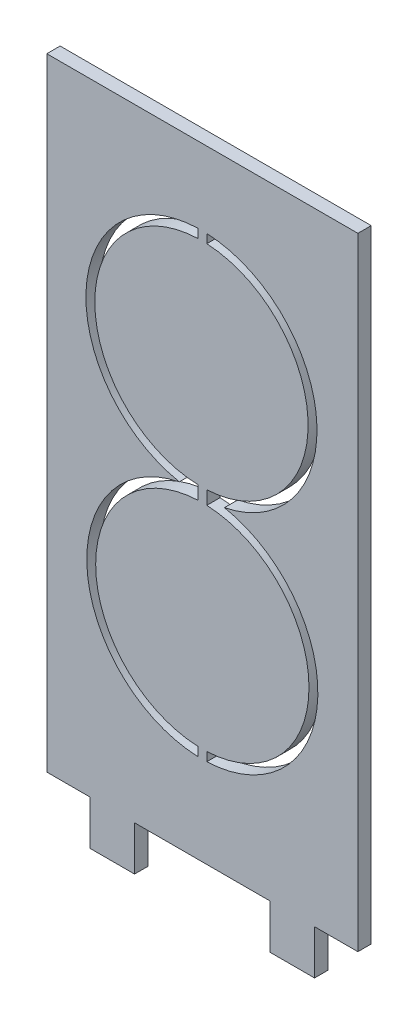
ISO-10303-21;
HEADER;
FILE_DESCRIPTION(('STEP AP214'),'2;1');
FILE_NAME('part.step','',(''),(''),'','','');
FILE_SCHEMA(('AUTOMOTIVE_DESIGN { 1 0 10303 214 1 1 1 1 }'));
ENDSEC;
DATA;
#1=APPLICATION_CONTEXT('core data for automotive mechanical design processes');
#2=APPLICATION_PROTOCOL_DEFINITION('international standard','automotive_design',2000,#1);
#3=PRODUCT_CONTEXT('',#1,'mechanical');
#4=PRODUCT('Part','Part','',(#3));
#5=PRODUCT_RELATED_PRODUCT_CATEGORY('part','',(#4));
#6=PRODUCT_DEFINITION_FORMATION('','',#4);
#7=PRODUCT_DEFINITION_CONTEXT('part definition',#1,'design');
#8=PRODUCT_DEFINITION('design','',#6,#7);
#9=PRODUCT_DEFINITION_SHAPE('','',#8);
#10=(LENGTH_UNIT() NAMED_UNIT(*) SI_UNIT(.MILLI.,.METRE.));
#11=(NAMED_UNIT(*) PLANE_ANGLE_UNIT() SI_UNIT($,.RADIAN.));
#12=(NAMED_UNIT(*) SI_UNIT($,.STERADIAN.) SOLID_ANGLE_UNIT());
#13=UNCERTAINTY_MEASURE_WITH_UNIT(LENGTH_MEASURE(1.E-05),#10,'distance_accuracy_value','');
#14=(GEOMETRIC_REPRESENTATION_CONTEXT(3) GLOBAL_UNCERTAINTY_ASSIGNED_CONTEXT((#13)) GLOBAL_UNIT_ASSIGNED_CONTEXT((#10,
#11,#12)) REPRESENTATION_CONTEXT('',''));
#15=CARTESIAN_POINT('',(0.,0.,0.));
#16=DIRECTION('',(0.,0.,1.));
#17=DIRECTION('',(1.,0.,0.));
#18=AXIS2_PLACEMENT_3D('',#15,#16,#17);
#19=CARTESIAN_POINT('',(17.,68.1857282912457,0.));
#20=DIRECTION('',(-1.,0.,0.));
#21=DIRECTION('',(0.,-1.,0.));
#22=AXIS2_PLACEMENT_3D('',#19,#20,#21);
#23=PLANE('',#22);
#24=DIRECTION('',(0.,0.,1.));
#25=VECTOR('',#24,1.);
#26=CARTESIAN_POINT('',(17.,16.0104211917182,0.));
#27=LINE('',#26,#25);
#28=CARTESIAN_POINT('',(17.,16.0104211917182,0.));
#29=VERTEX_POINT('',#28);
#30=CARTESIAN_POINT('',(17.,16.0104211917182,1.5));
#31=VERTEX_POINT('',#30);
#32=EDGE_CURVE('E221',#29,#31,#27,.T.);
#33=ORIENTED_EDGE('',*,*,#32,.F.);
#34=DIRECTION('',(0.,-1.,0.));
#35=VECTOR('',#34,1.);
#36=CARTESIAN_POINT('',(17.,68.1857282912457,0.));
#37=LINE('',#36,#35);
#38=CARTESIAN_POINT('',(17.,15.0096189432334,0.));
#39=VERTEX_POINT('',#38);
#40=EDGE_CURVE('E254',#29,#39,#37,.T.);
#41=ORIENTED_EDGE('',*,*,#40,.T.);
#42=DIRECTION('',(0.,0.,1.));
#43=VECTOR('',#42,1.);
#44=CARTESIAN_POINT('',(17.,15.0096189432334,0.));
#45=LINE('',#44,#43);
#46=CARTESIAN_POINT('',(17.,15.0096189432334,1.5));
#47=VERTEX_POINT('',#46);
#48=EDGE_CURVE('E426',#47,#39,#45,.F.);
#49=ORIENTED_EDGE('',*,*,#48,.F.);
#50=DIRECTION('',(0.,-1.,0.));
#51=VECTOR('',#50,1.);
#52=CARTESIAN_POINT('',(17.,68.1857282912457,1.5));
#53=LINE('',#52,#51);
#54=EDGE_CURVE('E241',#31,#47,#53,.T.);
#55=ORIENTED_EDGE('',*,*,#54,.F.);
#56=EDGE_LOOP('',(#33,#41,#49,#55));
#57=FACE_BOUND('',#56,.T.);
#58=ADVANCED_FACE('F39',(#57),#23,.T.);
#59=CARTESIAN_POINT('',(18.,68.1857282912457,0.));
#60=DIRECTION('',(1.,0.,0.));
#61=DIRECTION('',(0.,1.,0.));
#62=AXIS2_PLACEMENT_3D('',#59,#60,#61);
#63=PLANE('',#62);
#64=DIRECTION('',(0.,0.,1.));
#65=VECTOR('',#64,1.);
#66=CARTESIAN_POINT('',(18.,39.9895788082818,0.));
#67=LINE('',#66,#65);
#68=CARTESIAN_POINT('',(18.,39.9895788082818,0.));
#69=VERTEX_POINT('',#68);
#70=CARTESIAN_POINT('',(18.,39.9895788082818,1.5));
#71=VERTEX_POINT('',#70);
#72=EDGE_CURVE('E11',#69,#71,#67,.T.);
#73=ORIENTED_EDGE('',*,*,#72,.F.);
#74=DIRECTION('',(0.,1.,0.));
#75=VECTOR('',#74,1.);
#76=CARTESIAN_POINT('',(18.,68.1857282912457,0.));
#77=LINE('',#76,#75);
#78=CARTESIAN_POINT('',(18.,41.5150093867371,0.));
#79=VERTEX_POINT('',#78);
#80=EDGE_CURVE('E453',#69,#79,#77,.T.);
#81=ORIENTED_EDGE('',*,*,#80,.T.);
#82=DIRECTION('',(0.,0.,1.));
#83=VECTOR('',#82,1.);
#84=CARTESIAN_POINT('',(18.,41.5150093867371,0.));
#85=LINE('',#84,#83);
#86=CARTESIAN_POINT('',(18.,41.5150093867371,1.5));
#87=VERTEX_POINT('',#86);
#88=EDGE_CURVE('E430',#87,#79,#85,.F.);
#89=ORIENTED_EDGE('',*,*,#88,.F.);
#90=DIRECTION('',(0.,1.,0.));
#91=VECTOR('',#90,1.);
#92=CARTESIAN_POINT('',(18.,68.1857282912457,1.5));
#93=LINE('',#92,#91);
#94=EDGE_CURVE('E255',#71,#87,#93,.T.);
#95=ORIENTED_EDGE('',*,*,#94,.F.);
#96=EDGE_LOOP('',(#73,#81,#89,#95));
#97=FACE_BOUND('',#96,.T.);
#98=ADVANCED_FACE('F526',(#97),#63,.T.);
#99=DIRECTION('',(0.,0.,1.));
#100=VECTOR('',#99,1.);
#101=CARTESIAN_POINT('',(17.,39.9895788082818,0.));
#102=LINE('',#101,#100);
#103=CARTESIAN_POINT('',(17.,39.9895788082818,1.5));
#104=VERTEX_POINT('',#103);
#105=CARTESIAN_POINT('',(17.,39.9895788082818,0.));
#106=VERTEX_POINT('',#105);
#107=EDGE_CURVE('E218',#104,#106,#102,.F.);
#108=ORIENTED_EDGE('',*,*,#107,.F.);
#109=CARTESIAN_POINT('',(17.,41.506668519548,1.5));
#110=VERTEX_POINT('',#109);
#111=EDGE_CURVE('E230',#110,#104,#53,.T.);
#112=ORIENTED_EDGE('',*,*,#111,.F.);
#113=DIRECTION('',(0.,0.,1.));
#114=VECTOR('',#113,1.);
#115=CARTESIAN_POINT('',(17.,41.506668519548,0.));
#116=LINE('',#115,#114);
#117=CARTESIAN_POINT('',(17.,41.506668519548,0.));
#118=VERTEX_POINT('',#117);
#119=EDGE_CURVE('E246',#118,#110,#116,.T.);
#120=ORIENTED_EDGE('',*,*,#119,.F.);
#121=EDGE_CURVE('E232',#118,#106,#37,.T.);
#122=ORIENTED_EDGE('',*,*,#121,.T.);
#123=EDGE_LOOP('',(#108,#112,#120,#122));
#124=FACE_BOUND('',#123,.T.);
#125=ADVANCED_FACE('F228',(#124),#23,.T.);
#126=DIRECTION('',(0.,0.,1.));
#127=VECTOR('',#126,1.);
#128=CARTESIAN_POINT('',(18.,65.4849906132629,0.));
#129=LINE('',#128,#127);
#130=CARTESIAN_POINT('',(18.,65.4849906132629,0.));
#131=VERTEX_POINT('',#130);
#132=CARTESIAN_POINT('',(18.,65.4849906132629,1.5));
#133=VERTEX_POINT('',#132);
#134=EDGE_CURVE('E434',#131,#133,#129,.T.);
#135=ORIENTED_EDGE('',*,*,#134,.F.);
#136=CARTESIAN_POINT('',(18.,66.4861464645983,0.));
#137=VERTEX_POINT('',#136);
#138=EDGE_CURVE('E460',#131,#137,#77,.T.);
#139=ORIENTED_EDGE('',*,*,#138,.T.);
#140=DIRECTION('',(0.,0.,1.));
#141=VECTOR('',#140,1.);
#142=CARTESIAN_POINT('',(18.,66.4861464645983,0.));
#143=LINE('',#142,#141);
#144=CARTESIAN_POINT('',(18.,66.4861464645983,1.5));
#145=VERTEX_POINT('',#144);
#146=EDGE_CURVE('E256',#145,#137,#143,.F.);
#147=ORIENTED_EDGE('',*,*,#146,.F.);
#148=EDGE_CURVE('E245',#133,#145,#93,.T.);
#149=ORIENTED_EDGE('',*,*,#148,.F.);
#150=EDGE_LOOP('',(#135,#139,#147,#149));
#151=FACE_BOUND('',#150,.T.);
#152=ADVANCED_FACE('F532',(#151),#63,.T.);
#153=CARTESIAN_POINT('',(17.4,53.5,0.));
#154=DIRECTION('',(0.,0.,1.));
#155=DIRECTION('',(1.,0.,0.));
#156=AXIS2_PLACEMENT_3D('',#153,#154,#155);
#157=CYLINDRICAL_SURFACE('',#156,13.);
#158=CARTESIAN_POINT('',(17.4,53.5,0.));
#159=DIRECTION('',(0.,0.,1.));
#160=DIRECTION('',(1.,0.,0.));
#161=AXIS2_PLACEMENT_3D('',#158,#159,#160);
#162=CIRCLE('',#161,13.);
#163=CARTESIAN_POINT('',(17.,66.4938446966246,0.));
#164=VERTEX_POINT('',#163);
#165=CARTESIAN_POINT('',(14.9057685249611,40.7415201003832,0.));
#166=VERTEX_POINT('',#165);
#167=EDGE_CURVE('E342',#164,#166,#162,.T.);
#168=ORIENTED_EDGE('',*,*,#167,.F.);
#169=DIRECTION('',(0.,0.,1.));
#170=VECTOR('',#169,1.);
#171=CARTESIAN_POINT('',(17.,66.4938446966246,0.));
#172=LINE('',#171,#170);
#173=CARTESIAN_POINT('',(17.,66.4938446966246,1.5));
#174=VERTEX_POINT('',#173);
#175=EDGE_CURVE('E260',#164,#174,#172,.T.);
#176=ORIENTED_EDGE('',*,*,#175,.T.);
#177=CARTESIAN_POINT('',(17.4,53.5,1.5));
#178=DIRECTION('',(0.,0.,1.));
#179=DIRECTION('',(1.,0.,0.));
#180=AXIS2_PLACEMENT_3D('',#177,#178,#179);
#181=CIRCLE('',#180,13.);
#182=CARTESIAN_POINT('',(14.9057685249611,40.7415201003832,1.5));
#183=VERTEX_POINT('',#182);
#184=EDGE_CURVE('E370',#174,#183,#181,.T.);
#185=ORIENTED_EDGE('',*,*,#184,.T.);
#186=DIRECTION('',(0.,0.,1.));
#187=VECTOR('',#186,1.);
#188=CARTESIAN_POINT('',(14.9057685249611,40.7415201003832,0.));
#189=LINE('',#188,#187);
#190=EDGE_CURVE('E386',#166,#183,#189,.T.);
#191=ORIENTED_EDGE('',*,*,#190,.F.);
#192=EDGE_LOOP('',(#168,#176,#185,#191));
#193=FACE_BOUND('',#192,.T.);
#194=ADVANCED_FACE('F493',(#193),#157,.F.);
#195=CARTESIAN_POINT('',(17.5,28.,0.));
#196=DIRECTION('',(0.,0.,1.));
#197=DIRECTION('',(1.,0.,0.));
#198=AXIS2_PLACEMENT_3D('',#195,#196,#197);
#199=CYLINDRICAL_SURFACE('',#198,13.);
#200=CARTESIAN_POINT('',(17.5,28.,1.5));
#201=DIRECTION('',(0.,0.,1.));
#202=DIRECTION('',(-1.,0.,0.));
#203=AXIS2_PLACEMENT_3D('',#200,#201,#202);
#204=CIRCLE('',#203,13.);
#205=CARTESIAN_POINT('',(14.9132835528399,40.7400509426765,1.5));
#206=VERTEX_POINT('',#205);
#207=EDGE_CURVE('E395',#206,#47,#204,.T.);
#208=ORIENTED_EDGE('',*,*,#207,.T.);
#209=ORIENTED_EDGE('',*,*,#48,.T.);
#210=CARTESIAN_POINT('',(17.5,28.,0.));
#211=DIRECTION('',(0.,0.,1.));
#212=DIRECTION('',(-1.,0.,0.));
#213=AXIS2_PLACEMENT_3D('',#210,#211,#212);
#214=CIRCLE('',#213,13.);
#215=CARTESIAN_POINT('',(14.9132835528399,40.7400509426765,0.));
#216=VERTEX_POINT('',#215);
#217=EDGE_CURVE('E290',#216,#39,#214,.T.);
#218=ORIENTED_EDGE('',*,*,#217,.F.);
#219=DIRECTION('',(0.,0.,1.));
#220=VECTOR('',#219,1.);
#221=CARTESIAN_POINT('',(14.9132835528399,40.7400509426765,0.));
#222=LINE('',#221,#220);
#223=EDGE_CURVE('E392',#216,#206,#222,.T.);
#224=ORIENTED_EDGE('',*,*,#223,.T.);
#225=EDGE_LOOP('',(#208,#209,#218,#224));
#226=FACE_BOUND('',#225,.T.);
#227=ADVANCED_FACE('F481',(#226),#199,.F.);
#228=CARTESIAN_POINT('',(0.,0.,1.5));
#229=DIRECTION('',(0.,1.,0.));
#230=DIRECTION('',(0.,0.,1.));
#231=AXIS2_PLACEMENT_3D('',#228,#229,#230);
#232=PLANE('',#231);
#233=DIRECTION('',(1.,0.,0.));
#234=VECTOR('',#233,1.);
#235=CARTESIAN_POINT('',(0.,0.,1.5));
#236=LINE('',#235,#234);
#237=CARTESIAN_POINT('',(4.875,0.,1.5));
#238=VERTEX_POINT('',#237);
#239=CARTESIAN_POINT('',(9.875,0.,1.5));
#240=VERTEX_POINT('',#239);
#241=EDGE_CURVE('E306',#238,#240,#236,.T.);
#242=ORIENTED_EDGE('',*,*,#241,.F.);
#243=DIRECTION('',(0.,0.,1.));
#244=VECTOR('',#243,1.);
#245=CARTESIAN_POINT('',(4.875,0.,-18.5));
#246=LINE('',#245,#244);
#247=CARTESIAN_POINT('',(4.875,0.,0.));
#248=VERTEX_POINT('',#247);
#249=EDGE_CURVE('E268',#248,#238,#246,.T.);
#250=ORIENTED_EDGE('',*,*,#249,.F.);
#251=DIRECTION('',(1.,0.,0.));
#252=VECTOR('',#251,1.);
#253=CARTESIAN_POINT('',(0.,0.,0.));
#254=LINE('',#253,#252);
#255=CARTESIAN_POINT('',(9.875,0.,0.));
#256=VERTEX_POINT('',#255);
#257=EDGE_CURVE('E264',#248,#256,#254,.T.);
#258=ORIENTED_EDGE('',*,*,#257,.T.);
#259=DIRECTION('',(0.,0.,1.));
#260=VECTOR('',#259,1.);
#261=CARTESIAN_POINT('',(9.875,0.,-18.5));
#262=LINE('',#261,#260);
#263=EDGE_CURVE('E327',#256,#240,#262,.T.);
#264=ORIENTED_EDGE('',*,*,#263,.T.);
#265=EDGE_LOOP('',(#242,#250,#258,#264));
#266=FACE_BOUND('',#265,.T.);
#267=ADVANCED_FACE('F632',(#266),#232,.F.);
#268=CARTESIAN_POINT('',(0.,0.,1.5));
#269=DIRECTION('',(1.,0.,0.));
#270=DIRECTION('',(0.,1.,0.));
#271=AXIS2_PLACEMENT_3D('',#268,#269,#270);
#272=PLANE('',#271);
#273=DIRECTION('',(0.,-1.,0.));
#274=VECTOR('',#273,1.);
#275=CARTESIAN_POINT('',(0.,0.,0.));
#276=LINE('',#275,#274);
#277=CARTESIAN_POINT('',(0.,75.,0.));
#278=VERTEX_POINT('',#277);
#279=CARTESIAN_POINT('',(0.,5.,0.));
#280=VERTEX_POINT('',#279);
#281=EDGE_CURVE('E323',#278,#280,#276,.T.);
#282=ORIENTED_EDGE('',*,*,#281,.T.);
#283=DIRECTION('',(0.,0.,1.));
#284=VECTOR('',#283,1.);
#285=CARTESIAN_POINT('',(0.,5.,-18.5));
#286=LINE('',#285,#284);
#287=CARTESIAN_POINT('',(0.,5.,1.5));
#288=VERTEX_POINT('',#287);
#289=EDGE_CURVE('E313',#280,#288,#286,.T.);
#290=ORIENTED_EDGE('',*,*,#289,.T.);
#291=DIRECTION('',(0.,-1.,0.));
#292=VECTOR('',#291,1.);
#293=CARTESIAN_POINT('',(0.,0.,1.5));
#294=LINE('',#293,#292);
#295=CARTESIAN_POINT('',(0.,75.,1.5));
#296=VERTEX_POINT('',#295);
#297=EDGE_CURVE('E331',#296,#288,#294,.T.);
#298=ORIENTED_EDGE('',*,*,#297,.F.);
#299=DIRECTION('',(0.,0.,-1.));
#300=VECTOR('',#299,1.);
#301=CARTESIAN_POINT('',(0.,75.,1.5));
#302=LINE('',#301,#300);
#303=EDGE_CURVE('E308',#296,#278,#302,.T.);
#304=ORIENTED_EDGE('',*,*,#303,.T.);
#305=EDGE_LOOP('',(#282,#290,#298,#304));
#306=FACE_BOUND('',#305,.T.);
#307=ADVANCED_FACE('F612',(#306),#272,.F.);
#308=CARTESIAN_POINT('',(25.125,0.,0.));
#309=VERTEX_POINT('',#308);
#310=CARTESIAN_POINT('',(30.125,0.,0.));
#311=VERTEX_POINT('',#310);
#312=EDGE_CURVE('E312',#309,#311,#254,.T.);
#313=ORIENTED_EDGE('',*,*,#312,.T.);
#314=DIRECTION('',(0.,0.,1.));
#315=VECTOR('',#314,1.);
#316=CARTESIAN_POINT('',(30.125,0.,-18.5));
#317=LINE('',#316,#315);
#318=CARTESIAN_POINT('',(30.125,0.,1.5));
#319=VERTEX_POINT('',#318);
#320=EDGE_CURVE('E319',#311,#319,#317,.T.);
#321=ORIENTED_EDGE('',*,*,#320,.T.);
#322=CARTESIAN_POINT('',(25.125,0.,1.5));
#323=VERTEX_POINT('',#322);
#324=EDGE_CURVE('E335',#323,#319,#236,.T.);
#325=ORIENTED_EDGE('',*,*,#324,.F.);
#326=DIRECTION('',(0.,0.,1.));
#327=VECTOR('',#326,1.);
#328=CARTESIAN_POINT('',(25.125,0.,-18.5));
#329=LINE('',#328,#327);
#330=EDGE_CURVE('E300',#309,#323,#329,.T.);
#331=ORIENTED_EDGE('',*,*,#330,.F.);
#332=EDGE_LOOP('',(#313,#321,#325,#331));
#333=FACE_BOUND('',#332,.T.);
#334=ADVANCED_FACE('F569',(#333),#232,.F.);
#335=CARTESIAN_POINT('',(35.,0.,1.5));
#336=DIRECTION('',(-1.,0.,0.));
#337=DIRECTION('',(0.,-1.,0.));
#338=AXIS2_PLACEMENT_3D('',#335,#336,#337);
#339=PLANE('',#338);
#340=DIRECTION('',(0.,1.,0.));
#341=VECTOR('',#340,1.);
#342=CARTESIAN_POINT('',(35.,0.,1.5));
#343=LINE('',#342,#341);
#344=CARTESIAN_POINT('',(35.,5.,1.5));
#345=VERTEX_POINT('',#344);
#346=CARTESIAN_POINT('',(35.,75.,1.5));
#347=VERTEX_POINT('',#346);
#348=EDGE_CURVE('E332',#345,#347,#343,.T.);
#349=ORIENTED_EDGE('',*,*,#348,.F.);
#350=DIRECTION('',(0.,0.,1.));
#351=VECTOR('',#350,1.);
#352=CARTESIAN_POINT('',(35.,5.,-18.5));
#353=LINE('',#352,#351);
#354=CARTESIAN_POINT('',(35.,5.,0.));
#355=VERTEX_POINT('',#354);
#356=EDGE_CURVE('E284',#355,#345,#353,.T.);
#357=ORIENTED_EDGE('',*,*,#356,.F.);
#358=DIRECTION('',(0.,1.,0.));
#359=VECTOR('',#358,1.);
#360=CARTESIAN_POINT('',(35.,0.,0.));
#361=LINE('',#360,#359);
#362=CARTESIAN_POINT('',(35.,75.,0.));
#363=VERTEX_POINT('',#362);
#364=EDGE_CURVE('E316',#355,#363,#361,.T.);
#365=ORIENTED_EDGE('',*,*,#364,.T.);
#366=DIRECTION('',(0.,0.,-1.));
#367=VECTOR('',#366,1.);
#368=CARTESIAN_POINT('',(35.,75.,1.5));
#369=LINE('',#368,#367);
#370=EDGE_CURVE('E302',#347,#363,#369,.T.);
#371=ORIENTED_EDGE('',*,*,#370,.F.);
#372=EDGE_LOOP('',(#349,#357,#365,#371));
#373=FACE_BOUND('',#372,.T.);
#374=ADVANCED_FACE('F563',(#373),#339,.F.);
#375=CARTESIAN_POINT('',(0.,75.,1.5));
#376=DIRECTION('',(0.,-1.,0.));
#377=DIRECTION('',(0.,0.,-1.));
#378=AXIS2_PLACEMENT_3D('',#375,#376,#377);
#379=PLANE('',#378);
#380=DIRECTION('',(-1.,0.,0.));
#381=VECTOR('',#380,1.);
#382=CARTESIAN_POINT('',(0.,75.,0.));
#383=LINE('',#382,#381);
#384=EDGE_CURVE('E307',#363,#278,#383,.T.);
#385=ORIENTED_EDGE('',*,*,#384,.T.);
#386=ORIENTED_EDGE('',*,*,#303,.F.);
#387=DIRECTION('',(-1.,0.,0.));
#388=VECTOR('',#387,1.);
#389=CARTESIAN_POINT('',(0.,75.,1.5));
#390=LINE('',#389,#388);
#391=EDGE_CURVE('E328',#347,#296,#390,.T.);
#392=ORIENTED_EDGE('',*,*,#391,.F.);
#393=ORIENTED_EDGE('',*,*,#370,.T.);
#394=EDGE_LOOP('',(#385,#386,#392,#393));
#395=FACE_BOUND('',#394,.T.);
#396=ADVANCED_FACE('F559',(#395),#379,.F.);
#397=CARTESIAN_POINT('',(0.,0.,1.5));
#398=DIRECTION('',(0.,0.,-1.));
#399=DIRECTION('',(-1.,0.,0.));
#400=AXIS2_PLACEMENT_3D('',#397,#398,#399);
#401=PLANE('',#400);
#402=CARTESIAN_POINT('',(17.5,28.,1.5));
#403=DIRECTION('',(0.,0.,1.));
#404=DIRECTION('',(1.,0.,0.));
#405=AXIS2_PLACEMENT_3D('',#402,#403,#404);
#406=CIRCLE('',#405,12.);
#407=CARTESIAN_POINT('',(18.,16.0104211917182,1.5));
#408=VERTEX_POINT('',#407);
#409=EDGE_CURVE('E63',#408,#71,#406,.T.);
#410=ORIENTED_EDGE('',*,*,#409,.T.);
#411=ORIENTED_EDGE('',*,*,#94,.T.);
#412=CARTESIAN_POINT('',(17.4,53.5,1.5));
#413=DIRECTION('',(0.,0.,1.));
#414=DIRECTION('',(1.,0.,0.));
#415=AXIS2_PLACEMENT_3D('',#412,#413,#414);
#416=CIRCLE('',#415,12.);
#417=EDGE_CURVE('E506',#87,#133,#416,.T.);
#418=ORIENTED_EDGE('',*,*,#417,.T.);
#419=ORIENTED_EDGE('',*,*,#148,.T.);
#420=CARTESIAN_POINT('',(19.9867106732113,40.759947884993,1.5));
#421=VERTEX_POINT('',#420);
#422=EDGE_CURVE('E401',#421,#145,#181,.T.);
#423=ORIENTED_EDGE('',*,*,#422,.F.);
#424=CARTESIAN_POINT('',(18.,15.0096189432334,1.5));
#425=VERTEX_POINT('',#424);
#426=EDGE_CURVE('E400',#425,#421,#204,.T.);
#427=ORIENTED_EDGE('',*,*,#426,.F.);
#428=EDGE_CURVE('E251',#425,#408,#93,.T.);
#429=ORIENTED_EDGE('',*,*,#428,.T.);
#430=EDGE_LOOP('',(#410,#411,#418,#419,#423,#427,#429));
#431=FACE_BOUND('',#430,.T.);
#432=ORIENTED_EDGE('',*,*,#111,.T.);
#433=EDGE_CURVE('E55',#104,#31,#406,.T.);
#434=ORIENTED_EDGE('',*,*,#433,.T.);
#435=ORIENTED_EDGE('',*,*,#54,.T.);
#436=ORIENTED_EDGE('',*,*,#207,.F.);
#437=DIRECTION('',(0.981421530739752,-0.191863959618376,0.));
#438=VECTOR('',#437,1.);
#439=CARTESIAN_POINT('',(14.9057685249611,40.7415201003832,1.5));
#440=LINE('',#439,#438);
#441=EDGE_CURVE('E391',#183,#206,#440,.T.);
#442=ORIENTED_EDGE('',*,*,#441,.F.);
#443=ORIENTED_EDGE('',*,*,#184,.F.);
#444=CARTESIAN_POINT('',(17.,65.493331480452,1.5));
#445=VERTEX_POINT('',#444);
#446=EDGE_CURVE('E240',#174,#445,#53,.T.);
#447=ORIENTED_EDGE('',*,*,#446,.T.);
#448=EDGE_CURVE('E237',#445,#110,#416,.T.);
#449=ORIENTED_EDGE('',*,*,#448,.T.);
#450=EDGE_LOOP('',(#432,#434,#435,#436,#442,#443,#447,#449));
#451=FACE_BOUND('',#450,.T.);
#452=DIRECTION('',(-1.,0.,0.));
#453=VECTOR('',#452,1.);
#454=CARTESIAN_POINT('',(4.875,5.,1.5));
#455=LINE('',#454,#453);
#456=CARTESIAN_POINT('',(4.875,5.,1.5));
#457=VERTEX_POINT('',#456);
#458=EDGE_CURVE('E362',#457,#288,#455,.T.);
#459=ORIENTED_EDGE('',*,*,#458,.F.);
#460=DIRECTION('',(0.,1.,0.));
#461=VECTOR('',#460,1.);
#462=CARTESIAN_POINT('',(4.875,5.,1.5));
#463=LINE('',#462,#461);
#464=EDGE_CURVE('E274',#238,#457,#463,.T.);
#465=ORIENTED_EDGE('',*,*,#464,.F.);
#466=ORIENTED_EDGE('',*,*,#241,.T.);
#467=DIRECTION('',(0.,-1.,0.));
#468=VECTOR('',#467,1.);
#469=CARTESIAN_POINT('',(9.875,0.,1.5));
#470=LINE('',#469,#468);
#471=CARTESIAN_POINT('',(9.875,5.,1.5));
#472=VERTEX_POINT('',#471);
#473=EDGE_CURVE('E296',#472,#240,#470,.T.);
#474=ORIENTED_EDGE('',*,*,#473,.F.);
#475=DIRECTION('',(-1.,0.,0.));
#476=VECTOR('',#475,1.);
#477=CARTESIAN_POINT('',(9.875,5.,1.5));
#478=LINE('',#477,#476);
#479=CARTESIAN_POINT('',(25.125,5.,1.5));
#480=VERTEX_POINT('',#479);
#481=EDGE_CURVE('E301',#480,#472,#478,.T.);
#482=ORIENTED_EDGE('',*,*,#481,.F.);
#483=DIRECTION('',(0.,1.,0.));
#484=VECTOR('',#483,1.);
#485=CARTESIAN_POINT('',(25.125,0.,1.5));
#486=LINE('',#485,#484);
#487=EDGE_CURVE('E280',#323,#480,#486,.T.);
#488=ORIENTED_EDGE('',*,*,#487,.F.);
#489=ORIENTED_EDGE('',*,*,#324,.T.);
#490=DIRECTION('',(0.,-1.,0.));
#491=VECTOR('',#490,1.);
#492=CARTESIAN_POINT('',(30.125,5.,1.5));
#493=LINE('',#492,#491);
#494=CARTESIAN_POINT('',(30.125,5.,1.5));
#495=VERTEX_POINT('',#494);
#496=EDGE_CURVE('E285',#495,#319,#493,.T.);
#497=ORIENTED_EDGE('',*,*,#496,.F.);
#498=DIRECTION('',(-1.,0.,0.));
#499=VECTOR('',#498,1.);
#500=CARTESIAN_POINT('',(30.125,5.,1.5));
#501=LINE('',#500,#499);
#502=EDGE_CURVE('E269',#345,#495,#501,.T.);
#503=ORIENTED_EDGE('',*,*,#502,.F.);
#504=ORIENTED_EDGE('',*,*,#348,.T.);
#505=ORIENTED_EDGE('',*,*,#391,.T.);
#506=ORIENTED_EDGE('',*,*,#297,.T.);
#507=EDGE_LOOP('',(#459,#465,#466,#474,#482,#488,#489,#497,#503,#504,#505,#506));
#508=FACE_BOUND('',#507,.T.);
#509=ADVANCED_FACE('F41',(#431,#451,#508),#401,.F.);
#510=CARTESIAN_POINT('',(0.,0.,0.));
#511=DIRECTION('',(0.,0.,-1.));
#512=DIRECTION('',(-1.,0.,0.));
#513=AXIS2_PLACEMENT_3D('',#510,#511,#512);
#514=PLANE('',#513);
#515=ORIENTED_EDGE('',*,*,#80,.F.);
#516=CARTESIAN_POINT('',(17.5,28.,0.));
#517=DIRECTION('',(0.,0.,1.));
#518=DIRECTION('',(1.,0.,0.));
#519=AXIS2_PLACEMENT_3D('',#516,#517,#518);
#520=CIRCLE('',#519,12.);
#521=CARTESIAN_POINT('',(18.,16.0104211917182,0.));
#522=VERTEX_POINT('',#521);
#523=EDGE_CURVE('E442',#522,#69,#520,.T.);
#524=ORIENTED_EDGE('',*,*,#523,.F.);
#525=CARTESIAN_POINT('',(18.,15.0096189432334,0.));
#526=VERTEX_POINT('',#525);
#527=EDGE_CURVE('E249',#526,#522,#77,.T.);
#528=ORIENTED_EDGE('',*,*,#527,.F.);
#529=CARTESIAN_POINT('',(19.9867106732113,40.759947884993,0.));
#530=VERTEX_POINT('',#529);
#531=EDGE_CURVE('E414',#526,#530,#214,.T.);
#532=ORIENTED_EDGE('',*,*,#531,.T.);
#533=EDGE_CURVE('E419',#530,#137,#162,.T.);
#534=ORIENTED_EDGE('',*,*,#533,.T.);
#535=ORIENTED_EDGE('',*,*,#138,.F.);
#536=CARTESIAN_POINT('',(17.4,53.5,0.));
#537=DIRECTION('',(0.,0.,1.));
#538=DIRECTION('',(1.,0.,0.));
#539=AXIS2_PLACEMENT_3D('',#536,#537,#538);
#540=CIRCLE('',#539,12.);
#541=EDGE_CURVE('E503',#79,#131,#540,.T.);
#542=ORIENTED_EDGE('',*,*,#541,.F.);
#543=EDGE_LOOP('',(#515,#524,#528,#532,#534,#535,#542));
#544=FACE_BOUND('',#543,.T.);
#545=ORIENTED_EDGE('',*,*,#40,.F.);
#546=EDGE_CURVE('E455',#106,#29,#520,.T.);
#547=ORIENTED_EDGE('',*,*,#546,.F.);
#548=ORIENTED_EDGE('',*,*,#121,.F.);
#549=CARTESIAN_POINT('',(17.,65.493331480452,0.));
#550=VERTEX_POINT('',#549);
#551=EDGE_CURVE('E499',#550,#118,#540,.T.);
#552=ORIENTED_EDGE('',*,*,#551,.F.);
#553=EDGE_CURVE('E463',#164,#550,#37,.T.);
#554=ORIENTED_EDGE('',*,*,#553,.F.);
#555=ORIENTED_EDGE('',*,*,#167,.T.);
#556=DIRECTION('',(0.981421530739752,-0.191863959618376,0.));
#557=VECTOR('',#556,1.);
#558=CARTESIAN_POINT('',(14.9057685249611,40.7415201003832,0.));
#559=LINE('',#558,#557);
#560=EDGE_CURVE('E415',#166,#216,#559,.T.);
#561=ORIENTED_EDGE('',*,*,#560,.T.);
#562=ORIENTED_EDGE('',*,*,#217,.T.);
#563=EDGE_LOOP('',(#545,#547,#548,#552,#554,#555,#561,#562));
#564=FACE_BOUND('',#563,.T.);
#565=DIRECTION('',(0.,-1.,0.));
#566=VECTOR('',#565,1.);
#567=CARTESIAN_POINT('',(4.875,0.,0.));
#568=LINE('',#567,#566);
#569=CARTESIAN_POINT('',(4.875,5.,0.));
#570=VERTEX_POINT('',#569);
#571=EDGE_CURVE('E265',#570,#248,#568,.T.);
#572=ORIENTED_EDGE('',*,*,#571,.F.);
#573=DIRECTION('',(1.,0.,0.));
#574=VECTOR('',#573,1.);
#575=CARTESIAN_POINT('',(0.,5.,0.));
#576=LINE('',#575,#574);
#577=EDGE_CURVE('E270',#280,#570,#576,.T.);
#578=ORIENTED_EDGE('',*,*,#577,.F.);
#579=ORIENTED_EDGE('',*,*,#281,.F.);
#580=ORIENTED_EDGE('',*,*,#384,.F.);
#581=ORIENTED_EDGE('',*,*,#364,.F.);
#582=DIRECTION('',(1.,0.,0.));
#583=VECTOR('',#582,1.);
#584=CARTESIAN_POINT('',(0.,5.,0.));
#585=LINE('',#584,#583);
#586=CARTESIAN_POINT('',(30.125,5.,0.));
#587=VERTEX_POINT('',#586);
#588=EDGE_CURVE('E281',#587,#355,#585,.T.);
#589=ORIENTED_EDGE('',*,*,#588,.F.);
#590=DIRECTION('',(0.,1.,0.));
#591=VECTOR('',#590,1.);
#592=CARTESIAN_POINT('',(30.125,0.,0.));
#593=LINE('',#592,#591);
#594=EDGE_CURVE('E275',#311,#587,#593,.T.);
#595=ORIENTED_EDGE('',*,*,#594,.F.);
#596=ORIENTED_EDGE('',*,*,#312,.F.);
#597=DIRECTION('',(0.,-1.,0.));
#598=VECTOR('',#597,1.);
#599=CARTESIAN_POINT('',(25.125,0.,0.));
#600=LINE('',#599,#598);
#601=CARTESIAN_POINT('',(25.125,5.,0.));
#602=VERTEX_POINT('',#601);
#603=EDGE_CURVE('E297',#602,#309,#600,.T.);
#604=ORIENTED_EDGE('',*,*,#603,.F.);
#605=DIRECTION('',(1.,0.,0.));
#606=VECTOR('',#605,1.);
#607=CARTESIAN_POINT('',(0.,5.,0.));
#608=LINE('',#607,#606);
#609=CARTESIAN_POINT('',(9.875,5.,0.));
#610=VERTEX_POINT('',#609);
#611=EDGE_CURVE('E291',#610,#602,#608,.T.);
#612=ORIENTED_EDGE('',*,*,#611,.F.);
#613=DIRECTION('',(0.,1.,0.));
#614=VECTOR('',#613,1.);
#615=CARTESIAN_POINT('',(9.875,0.,0.));
#616=LINE('',#615,#614);
#617=EDGE_CURVE('E286',#256,#610,#616,.T.);
#618=ORIENTED_EDGE('',*,*,#617,.F.);
#619=ORIENTED_EDGE('',*,*,#257,.F.);
#620=EDGE_LOOP('',(#572,#578,#579,#580,#581,#589,#595,#596,#604,#612,#618,#619));
#621=FACE_BOUND('',#620,.T.);
#622=ADVANCED_FACE('F450',(#544,#564,#621),#514,.T.);
#623=CARTESIAN_POINT('',(9.875,0.,-18.5));
#624=DIRECTION('',(-1.,0.,0.));
#625=DIRECTION('',(0.,-1.,0.));
#626=AXIS2_PLACEMENT_3D('',#623,#624,#625);
#627=PLANE('',#626);
#628=ORIENTED_EDGE('',*,*,#617,.T.);
#629=DIRECTION('',(0.,0.,1.));
#630=VECTOR('',#629,1.);
#631=CARTESIAN_POINT('',(9.875,5.,-18.5));
#632=LINE('',#631,#630);
#633=EDGE_CURVE('E289',#610,#472,#632,.T.);
#634=ORIENTED_EDGE('',*,*,#633,.T.);
#635=ORIENTED_EDGE('',*,*,#473,.T.);
#636=ORIENTED_EDGE('',*,*,#263,.F.);
#637=EDGE_LOOP('',(#628,#634,#635,#636));
#638=FACE_BOUND('',#637,.T.);
#639=ADVANCED_FACE('F551',(#638),#627,.F.);
#640=CARTESIAN_POINT('',(9.875,5.,-18.5));
#641=DIRECTION('',(0.,1.,0.));
#642=DIRECTION('',(0.,0.,1.));
#643=AXIS2_PLACEMENT_3D('',#640,#641,#642);
#644=PLANE('',#643);
#645=ORIENTED_EDGE('',*,*,#611,.T.);
#646=DIRECTION('',(0.,0.,1.));
#647=VECTOR('',#646,1.);
#648=CARTESIAN_POINT('',(25.125,5.,-18.5));
#649=LINE('',#648,#647);
#650=EDGE_CURVE('E295',#602,#480,#649,.T.);
#651=ORIENTED_EDGE('',*,*,#650,.T.);
#652=ORIENTED_EDGE('',*,*,#481,.T.);
#653=ORIENTED_EDGE('',*,*,#633,.F.);
#654=EDGE_LOOP('',(#645,#651,#652,#653));
#655=FACE_BOUND('',#654,.T.);
#656=ADVANCED_FACE('F556',(#655),#644,.F.);
#657=CARTESIAN_POINT('',(25.125,0.,-18.5));
#658=DIRECTION('',(1.,0.,0.));
#659=DIRECTION('',(0.,0.,-1.));
#660=AXIS2_PLACEMENT_3D('',#657,#658,#659);
#661=PLANE('',#660);
#662=ORIENTED_EDGE('',*,*,#603,.T.);
#663=ORIENTED_EDGE('',*,*,#330,.T.);
#664=ORIENTED_EDGE('',*,*,#487,.T.);
#665=ORIENTED_EDGE('',*,*,#650,.F.);
#666=EDGE_LOOP('',(#662,#663,#664,#665));
#667=FACE_BOUND('',#666,.T.);
#668=ADVANCED_FACE('F574',(#667),#661,.F.);
#669=CARTESIAN_POINT('',(30.125,5.,-18.5));
#670=DIRECTION('',(-1.,0.,0.));
#671=DIRECTION('',(0.,0.,1.));
#672=AXIS2_PLACEMENT_3D('',#669,#670,#671);
#673=PLANE('',#672);
#674=ORIENTED_EDGE('',*,*,#594,.T.);
#675=DIRECTION('',(0.,0.,1.));
#676=VECTOR('',#675,1.);
#677=CARTESIAN_POINT('',(30.125,5.,-18.5));
#678=LINE('',#677,#676);
#679=EDGE_CURVE('E279',#587,#495,#678,.T.);
#680=ORIENTED_EDGE('',*,*,#679,.T.);
#681=ORIENTED_EDGE('',*,*,#496,.T.);
#682=ORIENTED_EDGE('',*,*,#320,.F.);
#683=EDGE_LOOP('',(#674,#680,#681,#682));
#684=FACE_BOUND('',#683,.T.);
#685=ADVANCED_FACE('F577',(#684),#673,.F.);
#686=CARTESIAN_POINT('',(30.125,5.,-18.5));
#687=DIRECTION('',(0.,1.,0.));
#688=DIRECTION('',(0.,0.,1.));
#689=AXIS2_PLACEMENT_3D('',#686,#687,#688);
#690=PLANE('',#689);
#691=ORIENTED_EDGE('',*,*,#588,.T.);
#692=ORIENTED_EDGE('',*,*,#356,.T.);
#693=ORIENTED_EDGE('',*,*,#502,.T.);
#694=ORIENTED_EDGE('',*,*,#679,.F.);
#695=EDGE_LOOP('',(#691,#692,#693,#694));
#696=FACE_BOUND('',#695,.T.);
#697=ADVANCED_FACE('F586',(#696),#690,.F.);
#698=CARTESIAN_POINT('',(4.875,5.,-18.5));
#699=DIRECTION('',(1.,0.,0.));
#700=DIRECTION('',(0.,1.,0.));
#701=AXIS2_PLACEMENT_3D('',#698,#699,#700);
#702=PLANE('',#701);
#703=ORIENTED_EDGE('',*,*,#571,.T.);
#704=ORIENTED_EDGE('',*,*,#249,.T.);
#705=ORIENTED_EDGE('',*,*,#464,.T.);
#706=DIRECTION('',(0.,0.,1.));
#707=VECTOR('',#706,1.);
#708=CARTESIAN_POINT('',(4.875,5.,-18.5));
#709=LINE('',#708,#707);
#710=EDGE_CURVE('E273',#570,#457,#709,.T.);
#711=ORIENTED_EDGE('',*,*,#710,.F.);
#712=EDGE_LOOP('',(#703,#704,#705,#711));
#713=FACE_BOUND('',#712,.T.);
#714=ADVANCED_FACE('F582',(#713),#702,.F.);
#715=CARTESIAN_POINT('',(4.875,5.,-18.5));
#716=DIRECTION('',(0.,1.,0.));
#717=DIRECTION('',(-1.,0.,0.));
#718=AXIS2_PLACEMENT_3D('',#715,#716,#717);
#719=PLANE('',#718);
#720=ORIENTED_EDGE('',*,*,#577,.T.);
#721=ORIENTED_EDGE('',*,*,#710,.T.);
#722=ORIENTED_EDGE('',*,*,#458,.T.);
#723=ORIENTED_EDGE('',*,*,#289,.F.);
#724=EDGE_LOOP('',(#720,#721,#722,#723));
#725=FACE_BOUND('',#724,.T.);
#726=ADVANCED_FACE('F585',(#725),#719,.F.);
#727=ORIENTED_EDGE('',*,*,#422,.T.);
#728=ORIENTED_EDGE('',*,*,#146,.T.);
#729=ORIENTED_EDGE('',*,*,#533,.F.);
#730=DIRECTION('',(0.,0.,1.));
#731=VECTOR('',#730,1.);
#732=CARTESIAN_POINT('',(19.9867106732113,40.759947884993,0.));
#733=LINE('',#732,#731);
#734=EDGE_CURVE('E396',#530,#421,#733,.T.);
#735=ORIENTED_EDGE('',*,*,#734,.T.);
#736=EDGE_LOOP('',(#727,#728,#729,#735));
#737=FACE_BOUND('',#736,.T.);
#738=ADVANCED_FACE('F545',(#737),#157,.F.);
#739=ORIENTED_EDGE('',*,*,#531,.F.);
#740=DIRECTION('',(0.,0.,1.));
#741=VECTOR('',#740,1.);
#742=CARTESIAN_POINT('',(18.,15.0096189432334,0.));
#743=LINE('',#742,#741);
#744=EDGE_CURVE('E390',#526,#425,#743,.T.);
#745=ORIENTED_EDGE('',*,*,#744,.T.);
#746=ORIENTED_EDGE('',*,*,#426,.T.);
#747=ORIENTED_EDGE('',*,*,#734,.F.);
#748=EDGE_LOOP('',(#739,#745,#746,#747));
#749=FACE_BOUND('',#748,.T.);
#750=ADVANCED_FACE('F540',(#749),#199,.F.);
#751=CARTESIAN_POINT('',(14.9057685249611,40.7415201003832,0.));
#752=DIRECTION('',(-0.191863959618376,-0.981421530739752,0.));
#753=DIRECTION('',(0.981421530739752,-0.191863959618376,0.));
#754=AXIS2_PLACEMENT_3D('',#751,#752,#753);
#755=PLANE('',#754);
#756=ORIENTED_EDGE('',*,*,#441,.T.);
#757=ORIENTED_EDGE('',*,*,#223,.F.);
#758=ORIENTED_EDGE('',*,*,#560,.F.);
#759=ORIENTED_EDGE('',*,*,#190,.T.);
#760=EDGE_LOOP('',(#756,#757,#758,#759));
#761=FACE_BOUND('',#760,.T.);
#762=ADVANCED_FACE('F488',(#761),#755,.F.);
#763=DIRECTION('',(0.,0.,1.));
#764=VECTOR('',#763,1.);
#765=CARTESIAN_POINT('',(17.,65.493331480452,0.));
#766=LINE('',#765,#764);
#767=EDGE_CURVE('E495',#445,#550,#766,.F.);
#768=ORIENTED_EDGE('',*,*,#767,.F.);
#769=ORIENTED_EDGE('',*,*,#446,.F.);
#770=ORIENTED_EDGE('',*,*,#175,.F.);
#771=ORIENTED_EDGE('',*,*,#553,.T.);
#772=EDGE_LOOP('',(#768,#769,#770,#771));
#773=FACE_BOUND('',#772,.T.);
#774=ADVANCED_FACE('F494',(#773),#23,.T.);
#775=DIRECTION('',(0.,0.,1.));
#776=VECTOR('',#775,1.);
#777=CARTESIAN_POINT('',(18.,16.0104211917182,0.));
#778=LINE('',#777,#776);
#779=EDGE_CURVE('E48',#408,#522,#778,.F.);
#780=ORIENTED_EDGE('',*,*,#779,.F.);
#781=ORIENTED_EDGE('',*,*,#428,.F.);
#782=ORIENTED_EDGE('',*,*,#744,.F.);
#783=ORIENTED_EDGE('',*,*,#527,.T.);
#784=EDGE_LOOP('',(#780,#781,#782,#783));
#785=FACE_BOUND('',#784,.T.);
#786=ADVANCED_FACE('F458',(#785),#63,.T.);
#787=CARTESIAN_POINT('',(17.4,53.5,0.));
#788=DIRECTION('',(0.,0.,1.));
#789=DIRECTION('',(1.,0.,0.));
#790=AXIS2_PLACEMENT_3D('',#787,#788,#789);
#791=CYLINDRICAL_SURFACE('',#790,12.);
#792=ORIENTED_EDGE('',*,*,#541,.T.);
#793=ORIENTED_EDGE('',*,*,#134,.T.);
#794=ORIENTED_EDGE('',*,*,#417,.F.);
#795=ORIENTED_EDGE('',*,*,#88,.T.);
#796=EDGE_LOOP('',(#792,#793,#794,#795));
#797=FACE_BOUND('',#796,.T.);
#798=ADVANCED_FACE('F516',(#797),#791,.T.);
#799=ORIENTED_EDGE('',*,*,#551,.T.);
#800=ORIENTED_EDGE('',*,*,#119,.T.);
#801=ORIENTED_EDGE('',*,*,#448,.F.);
#802=ORIENTED_EDGE('',*,*,#767,.T.);
#803=EDGE_LOOP('',(#799,#800,#801,#802));
#804=FACE_BOUND('',#803,.T.);
#805=ADVANCED_FACE('F513',(#804),#791,.T.);
#806=CARTESIAN_POINT('',(17.5,28.,0.));
#807=DIRECTION('',(0.,0.,1.));
#808=DIRECTION('',(1.,0.,0.));
#809=AXIS2_PLACEMENT_3D('',#806,#807,#808);
#810=CYLINDRICAL_SURFACE('',#809,12.);
#811=ORIENTED_EDGE('',*,*,#523,.T.);
#812=ORIENTED_EDGE('',*,*,#72,.T.);
#813=ORIENTED_EDGE('',*,*,#409,.F.);
#814=ORIENTED_EDGE('',*,*,#779,.T.);
#815=EDGE_LOOP('',(#811,#812,#813,#814));
#816=FACE_BOUND('',#815,.T.);
#817=ADVANCED_FACE('F441',(#816),#810,.T.);
#818=ORIENTED_EDGE('',*,*,#546,.T.);
#819=ORIENTED_EDGE('',*,*,#32,.T.);
#820=ORIENTED_EDGE('',*,*,#433,.F.);
#821=ORIENTED_EDGE('',*,*,#107,.T.);
#822=EDGE_LOOP('',(#818,#819,#820,#821));
#823=FACE_BOUND('',#822,.T.);
#824=ADVANCED_FACE('F217',(#823),#810,.T.);
#825=CLOSED_SHELL('',(#58,#98,#125,#152,#194,#227,#267,#307,#334,#374,#396,#509,#622,#639,#656,
#668,#685,#697,#714,#726,#738,#750,#762,#774,#786,#798,#805,#817,#824));
#826=MANIFOLD_SOLID_BREP('B2',#825);
#827=ADVANCED_BREP_SHAPE_REPRESENTATION('',(#18,#826),#14);
#828=SHAPE_DEFINITION_REPRESENTATION(#9,#827);
ENDSEC;
END-ISO-10303-21;
